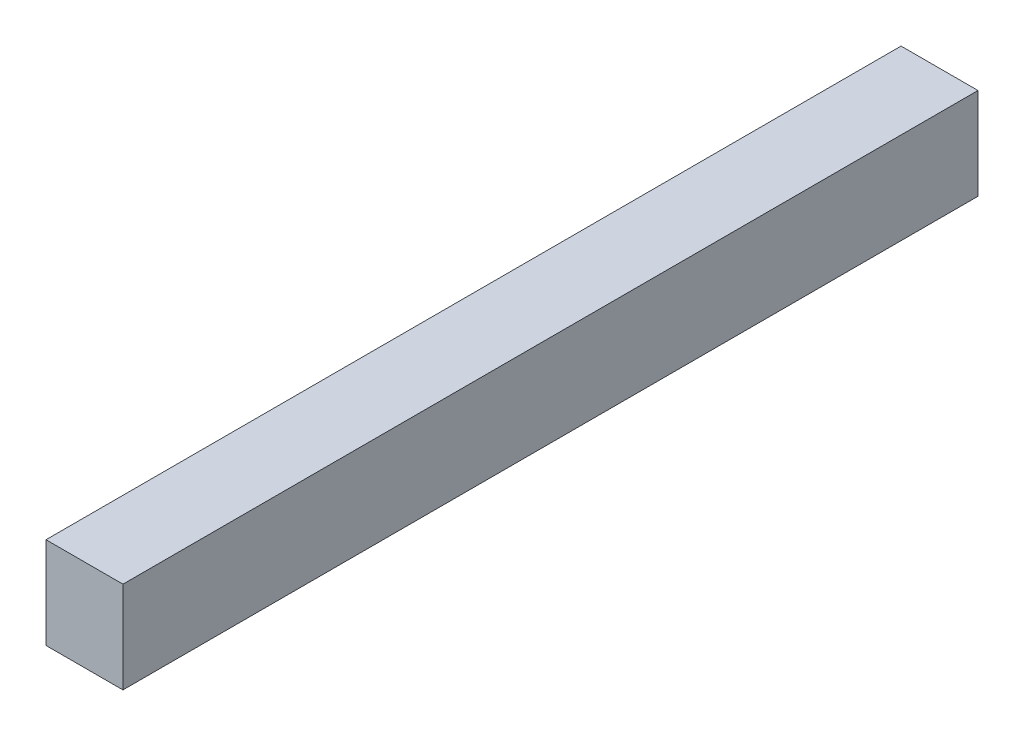
ISO-10303-21;
HEADER;
FILE_DESCRIPTION(('STEP AP214'),'2;1');
FILE_NAME('part.step','',(''),(''),'','','');
FILE_SCHEMA(('AUTOMOTIVE_DESIGN { 1 0 10303 214 1 1 1 1 }'));
ENDSEC;
DATA;
#1=APPLICATION_CONTEXT('core data for automotive mechanical design processes');
#2=APPLICATION_PROTOCOL_DEFINITION('international standard','automotive_design',2000,#1);
#3=PRODUCT_CONTEXT('',#1,'mechanical');
#4=PRODUCT('Part','Part','',(#3));
#5=PRODUCT_RELATED_PRODUCT_CATEGORY('part','',(#4));
#6=PRODUCT_DEFINITION_FORMATION('','',#4);
#7=PRODUCT_DEFINITION_CONTEXT('part definition',#1,'design');
#8=PRODUCT_DEFINITION('design','',#6,#7);
#9=PRODUCT_DEFINITION_SHAPE('','',#8);
#10=(LENGTH_UNIT() NAMED_UNIT(*) SI_UNIT(.MILLI.,.METRE.));
#11=(NAMED_UNIT(*) PLANE_ANGLE_UNIT() SI_UNIT($,.RADIAN.));
#12=(NAMED_UNIT(*) SI_UNIT($,.STERADIAN.) SOLID_ANGLE_UNIT());
#13=UNCERTAINTY_MEASURE_WITH_UNIT(LENGTH_MEASURE(1.E-05),#10,'distance_accuracy_value','');
#14=(GEOMETRIC_REPRESENTATION_CONTEXT(3) GLOBAL_UNCERTAINTY_ASSIGNED_CONTEXT((#13)) GLOBAL_UNIT_ASSIGNED_CONTEXT((#10,
#11,#12)) REPRESENTATION_CONTEXT('',''));
#15=CARTESIAN_POINT('',(0.,0.,0.));
#16=DIRECTION('',(0.,0.,1.));
#17=DIRECTION('',(1.,0.,0.));
#18=AXIS2_PLACEMENT_3D('',#15,#16,#17);
#19=CARTESIAN_POINT('',(0.,0.,700.));
#20=DIRECTION('',(1.,0.,0.));
#21=DIRECTION('',(0.,0.,-1.));
#22=AXIS2_PLACEMENT_3D('',#19,#20,#21);
#23=PLANE('',#22);
#24=DIRECTION('',(0.,-1.,0.));
#25=VECTOR('',#24,1.);
#26=CARTESIAN_POINT('',(0.,0.,0.));
#27=LINE('',#26,#25);
#28=CARTESIAN_POINT('',(0.,75.,0.));
#29=VERTEX_POINT('',#28);
#30=CARTESIAN_POINT('',(0.,0.,0.));
#31=VERTEX_POINT('',#30);
#32=EDGE_CURVE('E96',#29,#31,#27,.T.);
#33=ORIENTED_EDGE('',*,*,#32,.T.);
#34=DIRECTION('',(0.,0.,-1.));
#35=VECTOR('',#34,1.);
#36=CARTESIAN_POINT('',(0.,0.,700.));
#37=LINE('',#36,#35);
#38=CARTESIAN_POINT('',(0.,0.,700.));
#39=VERTEX_POINT('',#38);
#40=EDGE_CURVE('E11',#39,#31,#37,.T.);
#41=ORIENTED_EDGE('',*,*,#40,.F.);
#42=DIRECTION('',(0.,-1.,0.));
#43=VECTOR('',#42,1.);
#44=CARTESIAN_POINT('',(0.,0.,700.));
#45=LINE('',#44,#43);
#46=CARTESIAN_POINT('',(0.,75.,700.));
#47=VERTEX_POINT('',#46);
#48=EDGE_CURVE('E84',#47,#39,#45,.T.);
#49=ORIENTED_EDGE('',*,*,#48,.F.);
#50=DIRECTION('',(0.,0.,-1.));
#51=VECTOR('',#50,1.);
#52=CARTESIAN_POINT('',(0.,75.,700.));
#53=LINE('',#52,#51);
#54=EDGE_CURVE('E92',#47,#29,#53,.T.);
#55=ORIENTED_EDGE('',*,*,#54,.T.);
#56=EDGE_LOOP('',(#33,#41,#49,#55));
#57=FACE_BOUND('',#56,.T.);
#58=ADVANCED_FACE('F33',(#57),#23,.F.);
#59=CARTESIAN_POINT('',(0.,0.,700.));
#60=DIRECTION('',(0.,1.,0.));
#61=DIRECTION('',(0.,0.,1.));
#62=AXIS2_PLACEMENT_3D('',#59,#60,#61);
#63=PLANE('',#62);
#64=DIRECTION('',(1.,0.,0.));
#65=VECTOR('',#64,1.);
#66=CARTESIAN_POINT('',(0.,0.,0.));
#67=LINE('',#66,#65);
#68=CARTESIAN_POINT('',(63.,0.,0.));
#69=VERTEX_POINT('',#68);
#70=EDGE_CURVE('E88',#31,#69,#67,.T.);
#71=ORIENTED_EDGE('',*,*,#70,.T.);
#72=DIRECTION('',(0.,0.,-1.));
#73=VECTOR('',#72,1.);
#74=CARTESIAN_POINT('',(63.,0.,700.));
#75=LINE('',#74,#73);
#76=CARTESIAN_POINT('',(63.,0.,700.));
#77=VERTEX_POINT('',#76);
#78=EDGE_CURVE('E41',#77,#69,#75,.T.);
#79=ORIENTED_EDGE('',*,*,#78,.F.);
#80=DIRECTION('',(1.,0.,0.));
#81=VECTOR('',#80,1.);
#82=CARTESIAN_POINT('',(0.,0.,700.));
#83=LINE('',#82,#81);
#84=EDGE_CURVE('E79',#39,#77,#83,.T.);
#85=ORIENTED_EDGE('',*,*,#84,.F.);
#86=ORIENTED_EDGE('',*,*,#40,.T.);
#87=EDGE_LOOP('',(#71,#79,#85,#86));
#88=FACE_BOUND('',#87,.T.);
#89=ADVANCED_FACE('F87',(#88),#63,.F.);
#90=CARTESIAN_POINT('',(63.,0.,700.));
#91=DIRECTION('',(-1.,0.,0.));
#92=DIRECTION('',(0.,0.,1.));
#93=AXIS2_PLACEMENT_3D('',#90,#91,#92);
#94=PLANE('',#93);
#95=DIRECTION('',(0.,1.,0.));
#96=VECTOR('',#95,1.);
#97=CARTESIAN_POINT('',(63.,0.,0.));
#98=LINE('',#97,#96);
#99=CARTESIAN_POINT('',(63.,75.,0.));
#100=VERTEX_POINT('',#99);
#101=EDGE_CURVE('E66',#69,#100,#98,.T.);
#102=ORIENTED_EDGE('',*,*,#101,.T.);
#103=DIRECTION('',(0.,0.,-1.));
#104=VECTOR('',#103,1.);
#105=CARTESIAN_POINT('',(63.,75.,700.));
#106=LINE('',#105,#104);
#107=CARTESIAN_POINT('',(63.,75.,700.));
#108=VERTEX_POINT('',#107);
#109=EDGE_CURVE('E89',#108,#100,#106,.T.);
#110=ORIENTED_EDGE('',*,*,#109,.F.);
#111=DIRECTION('',(0.,1.,0.));
#112=VECTOR('',#111,1.);
#113=CARTESIAN_POINT('',(63.,0.,700.));
#114=LINE('',#113,#112);
#115=EDGE_CURVE('E82',#77,#108,#114,.T.);
#116=ORIENTED_EDGE('',*,*,#115,.F.);
#117=ORIENTED_EDGE('',*,*,#78,.T.);
#118=EDGE_LOOP('',(#102,#110,#116,#117));
#119=FACE_BOUND('',#118,.T.);
#120=ADVANCED_FACE('F90',(#119),#94,.F.);
#121=CARTESIAN_POINT('',(0.,75.,700.));
#122=DIRECTION('',(0.,-1.,0.));
#123=DIRECTION('',(0.,0.,-1.));
#124=AXIS2_PLACEMENT_3D('',#121,#122,#123);
#125=PLANE('',#124);
#126=DIRECTION('',(-1.,0.,0.));
#127=VECTOR('',#126,1.);
#128=CARTESIAN_POINT('',(0.,75.,0.));
#129=LINE('',#128,#127);
#130=EDGE_CURVE('E72',#100,#29,#129,.T.);
#131=ORIENTED_EDGE('',*,*,#130,.T.);
#132=ORIENTED_EDGE('',*,*,#54,.F.);
#133=DIRECTION('',(-1.,0.,0.));
#134=VECTOR('',#133,1.);
#135=CARTESIAN_POINT('',(0.,75.,700.));
#136=LINE('',#135,#134);
#137=EDGE_CURVE('E49',#108,#47,#136,.T.);
#138=ORIENTED_EDGE('',*,*,#137,.F.);
#139=ORIENTED_EDGE('',*,*,#109,.T.);
#140=EDGE_LOOP('',(#131,#132,#138,#139));
#141=FACE_BOUND('',#140,.T.);
#142=ADVANCED_FACE('F103',(#141),#125,.F.);
#143=CARTESIAN_POINT('',(0.,0.,700.));
#144=DIRECTION('',(0.,0.,-1.));
#145=DIRECTION('',(-1.,0.,0.));
#146=AXIS2_PLACEMENT_3D('',#143,#144,#145);
#147=PLANE('',#146);
#148=ORIENTED_EDGE('',*,*,#48,.T.);
#149=ORIENTED_EDGE('',*,*,#84,.T.);
#150=ORIENTED_EDGE('',*,*,#115,.T.);
#151=ORIENTED_EDGE('',*,*,#137,.T.);
#152=EDGE_LOOP('',(#148,#149,#150,#151));
#153=FACE_BOUND('',#152,.T.);
#154=ADVANCED_FACE('F80',(#153),#147,.F.);
#155=CARTESIAN_POINT('',(0.,0.,0.));
#156=DIRECTION('',(0.,0.,-1.));
#157=DIRECTION('',(-1.,0.,0.));
#158=AXIS2_PLACEMENT_3D('',#155,#156,#157);
#159=PLANE('',#158);
#160=ORIENTED_EDGE('',*,*,#32,.F.);
#161=ORIENTED_EDGE('',*,*,#130,.F.);
#162=ORIENTED_EDGE('',*,*,#101,.F.);
#163=ORIENTED_EDGE('',*,*,#70,.F.);
#164=EDGE_LOOP('',(#160,#161,#162,#163));
#165=FACE_BOUND('',#164,.T.);
#166=ADVANCED_FACE('F106',(#165),#159,.T.);
#167=CLOSED_SHELL('',(#58,#89,#120,#142,#154,#166));
#168=MANIFOLD_SOLID_BREP('B2',#167);
#169=ADVANCED_BREP_SHAPE_REPRESENTATION('',(#18,#168),#14);
#170=SHAPE_DEFINITION_REPRESENTATION(#9,#169);
ENDSEC;
END-ISO-10303-21;
